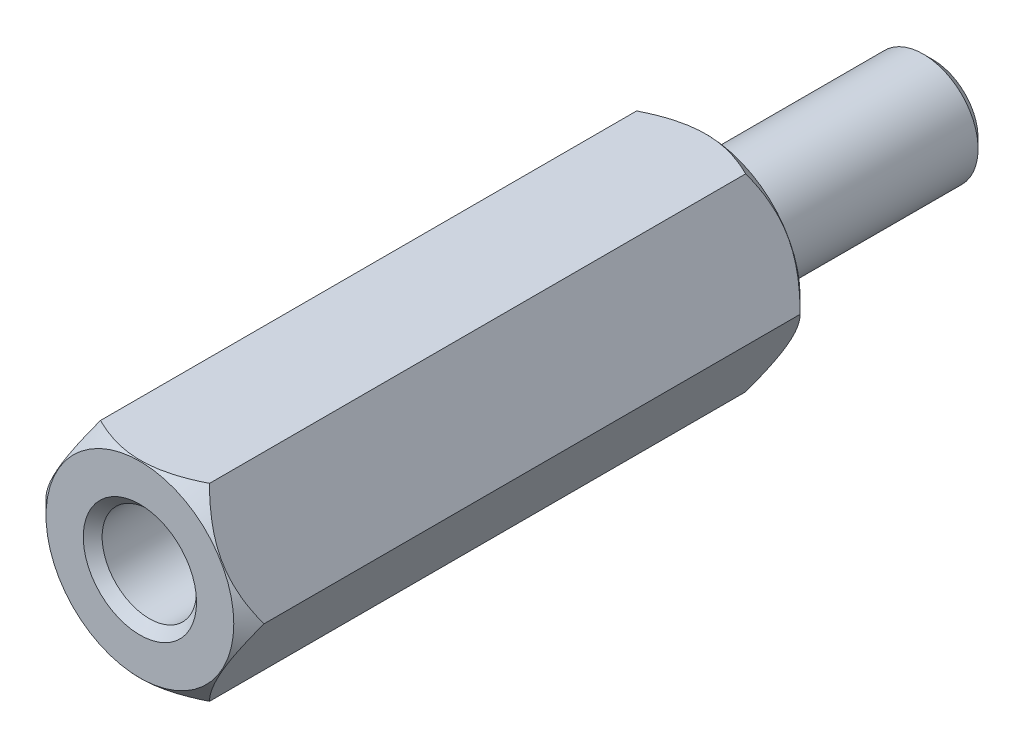
ISO-10303-21;
HEADER;
FILE_DESCRIPTION(('STEP AP214'),'2;1');
FILE_NAME('part.step','',(''),(''),'','','');
FILE_SCHEMA(('AUTOMOTIVE_DESIGN { 1 0 10303 214 1 1 1 1 }'));
ENDSEC;
DATA;
#1=APPLICATION_CONTEXT('core data for automotive mechanical design processes');
#2=APPLICATION_PROTOCOL_DEFINITION('international standard','automotive_design',2000,#1);
#3=PRODUCT_CONTEXT('',#1,'mechanical');
#4=PRODUCT('Part','Part','',(#3));
#5=PRODUCT_RELATED_PRODUCT_CATEGORY('part','',(#4));
#6=PRODUCT_DEFINITION_FORMATION('','',#4);
#7=PRODUCT_DEFINITION_CONTEXT('part definition',#1,'design');
#8=PRODUCT_DEFINITION('design','',#6,#7);
#9=PRODUCT_DEFINITION_SHAPE('','',#8);
#10=(LENGTH_UNIT() NAMED_UNIT(*) SI_UNIT(.MILLI.,.METRE.));
#11=(NAMED_UNIT(*) PLANE_ANGLE_UNIT() SI_UNIT($,.RADIAN.));
#12=(NAMED_UNIT(*) SI_UNIT($,.STERADIAN.) SOLID_ANGLE_UNIT());
#13=UNCERTAINTY_MEASURE_WITH_UNIT(LENGTH_MEASURE(1.E-05),#10,'distance_accuracy_value','');
#14=(GEOMETRIC_REPRESENTATION_CONTEXT(3) GLOBAL_UNCERTAINTY_ASSIGNED_CONTEXT((#13)) GLOBAL_UNIT_ASSIGNED_CONTEXT((#10,
#11,#12)) REPRESENTATION_CONTEXT('',''));
#15=CARTESIAN_POINT('',(0.,0.,0.));
#16=DIRECTION('',(0.,0.,1.));
#17=DIRECTION('',(1.,0.,0.));
#18=AXIS2_PLACEMENT_3D('',#15,#16,#17);
#19=CARTESIAN_POINT('',(0.,0.,7.5));
#20=DIRECTION('',(0.,0.,1.));
#21=DIRECTION('',(1.,0.,0.));
#22=AXIS2_PLACEMENT_3D('',#19,#20,#21);
#23=CYLINDRICAL_SURFACE('',#22,1.25);
#24=CARTESIAN_POINT('',(0.,0.,7.25));
#25=DIRECTION('',(0.,0.,1.));
#26=DIRECTION('',(1.,0.,0.));
#27=AXIS2_PLACEMENT_3D('',#24,#25,#26);
#28=CIRCLE('',#27,1.25);
#29=CARTESIAN_POINT('',(1.25,0.,7.25));
#30=VERTEX_POINT('',#29);
#31=EDGE_CURVE('E26',#30,#30,#28,.T.);
#32=ORIENTED_EDGE('',*,*,#31,.T.);
#33=EDGE_LOOP('',(#32));
#34=FACE_BOUND('',#33,.T.);
#35=CARTESIAN_POINT('',(0.,0.,-5.5));
#36=DIRECTION('',(0.,0.,-1.));
#37=DIRECTION('',(-1.,0.,0.));
#38=AXIS2_PLACEMENT_3D('',#35,#36,#37);
#39=CIRCLE('',#38,1.25);
#40=CARTESIAN_POINT('',(-1.25,0.,-5.5));
#41=VERTEX_POINT('',#40);
#42=EDGE_CURVE('E90',#41,#41,#39,.F.);
#43=ORIENTED_EDGE('',*,*,#42,.F.);
#44=EDGE_LOOP('',(#43));
#45=FACE_BOUND('',#44,.T.);
#46=ADVANCED_FACE('F17',(#34,#45),#23,.F.);
#47=CARTESIAN_POINT('',(1.44337567297409,-2.5,7.5));
#48=DIRECTION('',(-0.866025403784442,0.5,0.));
#49=DIRECTION('',(-0.5,-0.866025403784442,0.));
#50=AXIS2_PLACEMENT_3D('',#47,#48,#49);
#51=PLANE('',#50);
#52=CARTESIAN_POINT('',(1.44326020292026,-2.5002,7.09988452301824));
#53=CARTESIAN_POINT('',(1.49287669073472,-2.41426172221223,7.14945929464527));
#54=CARTESIAN_POINT('',(1.54332283764113,-2.32688643272424,7.19612251863748));
#55=CARTESIAN_POINT('',(1.64618811625262,-2.14871854383441,7.28156185996168));
#56=CARTESIAN_POINT('',(1.69861703122362,-2.05790899931892,7.32029043759398));
#57=CARTESIAN_POINT('',(1.80433744175989,-1.87479587687307,7.38663329610224));
#58=CARTESIAN_POINT('',(1.85760201171319,-1.78253893547066,7.41441433146912));
#59=CARTESIAN_POINT('',(1.96530378549012,-1.59599399122371,7.45721682408932));
#60=CARTESIAN_POINT('',(2.01973769896308,-1.50171168743371,7.47227023332866));
#61=CARTESIAN_POINT('',(2.11355131286834,-1.33922174170815,7.48585227779051));
#62=CARTESIAN_POINT('',(2.15280980880344,-1.27122403211985,7.48786290075918));
#63=CARTESIAN_POINT('',(2.23126263056552,-1.13533975883078,7.48447588281249));
#64=CARTESIAN_POINT('',(2.2704569290736,-1.06745324244776,7.47907564470016));
#65=CARTESIAN_POINT('',(2.34847544336507,-0.932321211763895,7.46117421159751));
#66=CARTESIAN_POINT('',(2.38729919566126,-0.865076500246443,7.44866507295349));
#67=CARTESIAN_POINT('',(2.46427534467606,-0.731749899181799,7.41723249804427));
#68=CARTESIAN_POINT('',(2.50242779262543,-0.665667920900333,7.39830955350317));
#69=CARTESIAN_POINT('',(2.60015256308362,-0.496403653308724,7.34213263859175));
#70=CARTESIAN_POINT('',(2.6591189485299,-0.394270877777111,7.3006441684038));
#71=CARTESIAN_POINT('',(2.74582384890659,-0.244093585059505,7.23060595327689));
#72=CARTESIAN_POINT('',(2.77439698586414,-0.194603460117405,7.20599774788391));
#73=CARTESIAN_POINT('',(2.83101398781795,-0.0965399361611646,7.15453811328475));
#74=CARTESIAN_POINT('',(2.85905816495514,-0.0479659965030795,7.12768806122064));
#75=CARTESIAN_POINT('',(2.88686681600197,0.000199999999999736,7.09988452301824));
#76=B_SPLINE_CURVE_WITH_KNOTS('',3,(#52,#53,#54,#55,#56,#57,#58,#59,#60,#61,#62,#63,#64,#65,#66,
#67,#68,#69,#70,#71,#72,#73,#74,#75),.UNSPECIFIED.,.F.,.F.,(4,2,2,2,2,2,2,2,2,2,2,4),(0.,
0.333012085133919,0.667964518301393,0.997597032043296,1.32639954393844,1.56169424147168,
1.79707142102082,2.0327121352217,2.26833478775649,2.64260240809531,2.82922877818861,
3.01574133749022),.UNSPECIFIED.);
#77=CARTESIAN_POINT('',(1.4433756729741,-2.5,7.1));
#78=VERTEX_POINT('',#77);
#79=CARTESIAN_POINT('',(2.88675134594813,0.,7.1));
#80=VERTEX_POINT('',#79);
#81=EDGE_CURVE('E70',#78,#80,#76,.T.);
#82=ORIENTED_EDGE('',*,*,#81,.F.);
#83=DIRECTION('',(0.,0.,-1.));
#84=VECTOR('',#83,1.);
#85=CARTESIAN_POINT('',(1.44337567297409,-2.5,7.5));
#86=LINE('',#85,#84);
#87=CARTESIAN_POINT('',(1.44337567297409,-2.5,-7.1));
#88=VERTEX_POINT('',#87);
#89=EDGE_CURVE('E41',#78,#88,#86,.T.);
#90=ORIENTED_EDGE('',*,*,#89,.T.);
#91=CARTESIAN_POINT('',(2.88686681600197,0.0002,-7.09988452301824));
#92=CARTESIAN_POINT('',(2.83725032818752,-0.0857382777877744,-7.14945929464526));
#93=CARTESIAN_POINT('',(2.78680418128111,-0.173113567275765,-7.19612251863748));
#94=CARTESIAN_POINT('',(2.68393890266962,-0.3512814561656,-7.28156185996168));
#95=CARTESIAN_POINT('',(2.63150998769862,-0.442091000681084,-7.32029043759398));
#96=CARTESIAN_POINT('',(2.52578957716236,-0.62520412312693,-7.38663329610224));
#97=CARTESIAN_POINT('',(2.47252500720906,-0.717461064529351,-7.41441433146912));
#98=CARTESIAN_POINT('',(2.36482323343212,-0.904006008776288,-7.45721682408932));
#99=CARTESIAN_POINT('',(2.31038931995914,-0.998288312566276,-7.47227023332865));
#100=CARTESIAN_POINT('',(2.21657570605388,-1.16077825829184,-7.48585227779051));
#101=CARTESIAN_POINT('',(2.17731721011881,-1.22877596788015,-7.48786290075918));
#102=CARTESIAN_POINT('',(2.09886438835673,-1.36466024116922,-7.48447588281249));
#103=CARTESIAN_POINT('',(2.05967008984865,-1.43254675755224,-7.47907564470016));
#104=CARTESIAN_POINT('',(1.98165157555718,-1.5676787882361,-7.46117421159751));
#105=CARTESIAN_POINT('',(1.942827823261,-1.63492349975356,-7.4486650729535));
#106=CARTESIAN_POINT('',(1.86585167424619,-1.7682501008182,-7.41723249804428));
#107=CARTESIAN_POINT('',(1.8276992262968,-1.83433207909966,-7.39830955350318));
#108=CARTESIAN_POINT('',(1.7299744558386,-2.00359634669126,-7.34213263859175));
#109=CARTESIAN_POINT('',(1.67100807039234,-2.10572912222289,-7.3006441684038));
#110=CARTESIAN_POINT('',(1.58430317001566,-2.2559064149405,-7.2306059532769));
#111=CARTESIAN_POINT('',(1.5557300330581,-2.3053965398826,-7.20599774788391));
#112=CARTESIAN_POINT('',(1.49911303110429,-2.40346006383884,-7.15453811328476));
#113=CARTESIAN_POINT('',(1.47106885396709,-2.45203400349692,-7.12768806122064));
#114=CARTESIAN_POINT('',(1.44326020292026,-2.5002,-7.09988452301824));
#115=B_SPLINE_CURVE_WITH_KNOTS('',3,(#91,#92,#93,#94,#95,#96,#97,#98,#99,#100,#101,#102,#103,
#104,#105,#106,#107,#108,#109,#110,#111,#112,#113,#114),.UNSPECIFIED.,.F.,.F.,(4,2,2,2,2,2,2,2,
2,2,2,4),(0.,0.333012085133916,0.667964518301388,0.997597032043286,1.32639954393842,
1.56169424147166,1.7970714210208,2.03271213522168,2.26833478775648,2.6426024080953,
2.82922877818861,3.01574133749022),.UNSPECIFIED.);
#116=CARTESIAN_POINT('',(2.88675134594813,0.,-7.1));
#117=VERTEX_POINT('',#116);
#118=EDGE_CURVE('E89',#117,#88,#115,.T.);
#119=ORIENTED_EDGE('',*,*,#118,.F.);
#120=DIRECTION('',(0.,0.,-1.));
#121=VECTOR('',#120,1.);
#122=CARTESIAN_POINT('',(2.88675134594813,0.,7.5));
#123=LINE('',#122,#121);
#124=EDGE_CURVE('E83',#80,#117,#123,.T.);
#125=ORIENTED_EDGE('',*,*,#124,.F.);
#126=EDGE_LOOP('',(#82,#90,#119,#125));
#127=FACE_BOUND('',#126,.T.);
#128=ADVANCED_FACE('F88',(#127),#51,.F.);
#129=CARTESIAN_POINT('',(2.88675134594813,0.,7.5));
#130=DIRECTION('',(-0.866025403784438,-0.5,0.));
#131=DIRECTION('',(0.5,-0.866025403784438,0.));
#132=AXIS2_PLACEMENT_3D('',#129,#130,#131);
#133=PLANE('',#132);
#134=CARTESIAN_POINT('',(2.88686681600197,-0.0002,7.09988452301824));
#135=CARTESIAN_POINT('',(2.83725032818751,0.0857382777877649,7.14945929464527));
#136=CARTESIAN_POINT('',(2.7868041812811,0.173113567275753,7.19612251863749));
#137=CARTESIAN_POINT('',(2.6839389026696,0.351281456165588,7.2815618599617));
#138=CARTESIAN_POINT('',(2.6315099876986,0.442091000681075,7.320290437594));
#139=CARTESIAN_POINT('',(2.52578957716234,0.625204123126921,7.38663329610226));
#140=CARTESIAN_POINT('',(2.47252500720904,0.717461064529341,7.41441433146914));
#141=CARTESIAN_POINT('',(2.3648232334321,0.904006008776286,7.45721682408934));
#142=CARTESIAN_POINT('',(2.31038931995913,0.998288312566283,7.47227023332866));
#143=CARTESIAN_POINT('',(2.21657570605387,1.16077825829184,7.48585227779052));
#144=CARTESIAN_POINT('',(2.17731721011878,1.22877596788015,7.4878629007592));
#145=CARTESIAN_POINT('',(2.0988643883567,1.36466024116922,7.48447588281251));
#146=CARTESIAN_POINT('',(2.05967008984862,1.43254675755224,7.47907564470018));
#147=CARTESIAN_POINT('',(1.98165157555715,1.5676787882361,7.46117421159753));
#148=CARTESIAN_POINT('',(1.94282782326097,1.63492349975356,7.44866507295352));
#149=CARTESIAN_POINT('',(1.86585167424616,1.7682501008182,7.4172324980443));
#150=CARTESIAN_POINT('',(1.82769922629678,1.83433207909966,7.39830955350319));
#151=CARTESIAN_POINT('',(1.72997445583858,2.00359634669126,7.34213263859176));
#152=CARTESIAN_POINT('',(1.67100807039231,2.10572912222289,7.30064416840382));
#153=CARTESIAN_POINT('',(1.58430317001562,2.25590641494051,7.23060595327691));
#154=CARTESIAN_POINT('',(1.55573003305807,2.30539653988261,7.20599774788393));
#155=CARTESIAN_POINT('',(1.49911303110426,2.40346006383885,7.15453811328477));
#156=CARTESIAN_POINT('',(1.47106885396706,2.45203400349693,7.12768806122065));
#157=CARTESIAN_POINT('',(1.44326020292022,2.5002,7.09988452301824));
#158=B_SPLINE_CURVE_WITH_KNOTS('',3,(#134,#135,#136,#137,#138,#139,#140,#141,#142,#143,#144,
#145,#146,#147,#148,#149,#150,#151,#152,#153,#154,#155,#156,#157),.UNSPECIFIED.,.F.,.F.,(4,2,2,
2,2,2,2,2,2,2,2,4),(0.,0.333012085133923,0.667964518301397,0.997597032043299,1.32639954393844,
1.56169424147168,1.79707142102083,2.0327121352217,2.2683347877565,2.64260240809533,
2.82922877818864,3.01574133749025),.UNSPECIFIED.);
#159=CARTESIAN_POINT('',(1.44337567297406,2.5,7.1));
#160=VERTEX_POINT('',#159);
#161=EDGE_CURVE('E73',#80,#160,#158,.T.);
#162=ORIENTED_EDGE('',*,*,#161,.F.);
#163=ORIENTED_EDGE('',*,*,#124,.T.);
#164=CARTESIAN_POINT('',(1.44326020292022,2.5002,-7.09988452301824));
#165=CARTESIAN_POINT('',(1.49287669073468,2.41426172221224,-7.14945929464527));
#166=CARTESIAN_POINT('',(1.5433228376411,2.32688643272425,-7.19612251863749));
#167=CARTESIAN_POINT('',(1.64618811625259,2.14871854383441,-7.2815618599617));
#168=CARTESIAN_POINT('',(1.69861703122359,2.05790899931893,-7.320290437594));
#169=CARTESIAN_POINT('',(1.80433744175985,1.87479587687308,-7.38663329610226));
#170=CARTESIAN_POINT('',(1.85760201171315,1.78253893547066,-7.41441433146914));
#171=CARTESIAN_POINT('',(1.96530378549009,1.59599399122372,-7.45721682408934));
#172=CARTESIAN_POINT('',(2.01973769896306,1.50171168743372,-7.47227023332866));
#173=CARTESIAN_POINT('',(2.11355131286832,1.33922174170816,-7.48585227779052));
#174=CARTESIAN_POINT('',(2.15280980880341,1.27122403211985,-7.4878629007592));
#175=CARTESIAN_POINT('',(2.23126263056549,1.13533975883079,-7.48447588281251));
#176=CARTESIAN_POINT('',(2.27045692907357,1.06745324244777,-7.47907564470018));
#177=CARTESIAN_POINT('',(2.34847544336504,0.932321211763901,-7.46117421159753));
#178=CARTESIAN_POINT('',(2.38729919566122,0.865076500246447,-7.44866507295352));
#179=CARTESIAN_POINT('',(2.46427534467603,0.731749899181808,-7.41723249804429));
#180=CARTESIAN_POINT('',(2.50242779262541,0.66566792090035,-7.39830955350319));
#181=CARTESIAN_POINT('',(2.60015256308361,0.496403653308741,-7.34213263859176));
#182=CARTESIAN_POINT('',(2.65911894852988,0.394270877777113,-7.30064416840382));
#183=CARTESIAN_POINT('',(2.74582384890657,0.244093585059495,-7.23060595327691));
#184=CARTESIAN_POINT('',(2.77439698586412,0.194603460117394,-7.20599774788393));
#185=CARTESIAN_POINT('',(2.83101398781794,0.096539936161155,-7.15453811328477));
#186=CARTESIAN_POINT('',(2.85905816495513,0.0479659965030728,-7.12768806122065));
#187=CARTESIAN_POINT('',(2.88686681600197,-0.000200000000000316,-7.09988452301824));
#188=B_SPLINE_CURVE_WITH_KNOTS('',3,(#164,#165,#166,#167,#168,#169,#170,#171,#172,#173,#174,
#175,#176,#177,#178,#179,#180,#181,#182,#183,#184,#185,#186,#187),.UNSPECIFIED.,.F.,.F.,(4,2,2,
2,2,2,2,2,2,2,2,4),(0.,0.333012085133922,0.667964518301395,0.997597032043296,1.32639954393844,
1.56169424147168,1.79707142102082,2.0327121352217,2.2683347877565,2.64260240809533,
2.82922877818864,3.01574133749025),.UNSPECIFIED.);
#189=CARTESIAN_POINT('',(1.44337567297406,2.5,-7.1));
#190=VERTEX_POINT('',#189);
#191=EDGE_CURVE('E215',#190,#117,#188,.T.);
#192=ORIENTED_EDGE('',*,*,#191,.F.);
#193=DIRECTION('',(0.,0.,-1.));
#194=VECTOR('',#193,1.);
#195=CARTESIAN_POINT('',(1.44337567297406,2.5,7.5));
#196=LINE('',#195,#194);
#197=EDGE_CURVE('E85',#160,#190,#196,.T.);
#198=ORIENTED_EDGE('',*,*,#197,.F.);
#199=EDGE_LOOP('',(#162,#163,#192,#198));
#200=FACE_BOUND('',#199,.T.);
#201=ADVANCED_FACE('F81',(#200),#133,.F.);
#202=CARTESIAN_POINT('',(1.44337567297406,2.5,7.5));
#203=DIRECTION('',(0.,-1.,0.));
#204=DIRECTION('',(1.,0.,0.));
#205=AXIS2_PLACEMENT_3D('',#202,#203,#204);
#206=PLANE('',#205);
#207=CARTESIAN_POINT('',(4.35790807222665,2.5,4.96267304580409));
#208=CARTESIAN_POINT('',(4.22900505074815,2.50000000000001,5.07444020651168));
#209=CARTESIAN_POINT('',(4.09952897907173,2.50000000000001,5.18556009439583));
#210=CARTESIAN_POINT('',(3.83898638028681,2.50000000000001,5.40604374915114));
#211=CARTESIAN_POINT('',(3.70791912620545,2.50000000000001,5.51540665588043));
#212=CARTESIAN_POINT('',(3.44083760855067,2.50000000000001,5.7342940749196));
#213=CARTESIAN_POINT('',(3.30477887797079,2.50000000000001,5.84376454299069));
#214=CARTESIAN_POINT('',(3.03009587684347,2.5,6.05938263287972));
#215=CARTESIAN_POINT('',(2.89147225782007,2.5,6.1655310805966));
#216=CARTESIAN_POINT('',(2.61062429451692,2.5,6.37338578520497));
#217=CARTESIAN_POINT('',(2.46839537969833,2.5,6.47508590704005));
#218=CARTESIAN_POINT('',(2.17925486790779,2.5,6.67194970638111));
#219=CARTESIAN_POINT('',(2.03233957265132,2.5,6.76710802470617));
#220=CARTESIAN_POINT('',(1.73361597358268,2.5,6.94680833734888));
#221=CARTESIAN_POINT('',(1.58185407011246,2.5,7.0314264527755));
#222=CARTESIAN_POINT('',(1.27084130527911,2.5,7.18552599595446));
#223=CARTESIAN_POINT('',(1.11160488303032,2.5,7.25503525688872));
#224=CARTESIAN_POINT('',(0.864657376231807,2.5,7.34259642513528));
#225=CARTESIAN_POINT('',(0.779993026222523,2.5,7.36920046305057));
#226=CARTESIAN_POINT('',(0.608668935092176,2.5,7.41504582346073));
#227=CARTESIAN_POINT('',(0.522009514777896,2.5,7.43428832104285));
#228=CARTESIAN_POINT('',(0.34773955693234,2.5,7.4641318069513));
#229=CARTESIAN_POINT('',(0.260138222188826,2.49999999999999,7.47478552783329));
#230=CARTESIAN_POINT('',(0.0842961272603183,2.5,7.48686770307153));
#231=CARTESIAN_POINT('',(-0.0039445643884417,2.5,7.48829713200226));
#232=CARTESIAN_POINT('',(-0.180192018780209,2.5,7.48181608276146));
#233=CARTESIAN_POINT('',(-0.268198313940583,2.5,7.47389317264444));
#234=CARTESIAN_POINT('',(-0.442968473014174,2.49999999999999,7.44928693602144));
#235=CARTESIAN_POINT('',(-0.529732088460505,2.49999999999999,7.43260188201526));
#236=CARTESIAN_POINT('',(-0.702003641636136,2.49999999999999,7.39141807606219));
#237=CARTESIAN_POINT('',(-0.787498274243353,2.49999999999999,7.36686463906262));
#238=CARTESIAN_POINT('',(-0.956318998116781,2.49999999999999,7.31127227919823));
#239=CARTESIAN_POINT('',(-1.03964506444263,2.5,7.28023328178095));
#240=CARTESIAN_POINT('',(-1.22260914379836,2.5,7.20532752613879));
#241=CARTESIAN_POINT('',(-1.32170415747565,2.49999999999999,7.16014559308748));
#242=CARTESIAN_POINT('',(-1.5169438537106,2.49999999999999,7.06375515379207));
#243=CARTESIAN_POINT('',(-1.61308679170486,2.49999999999999,7.01254316726495));
#244=CARTESIAN_POINT('',(-1.8029661421963,2.49999999999999,6.90543166741101));
#245=CARTESIAN_POINT('',(-1.89669715950608,2.49999999999999,6.84952266760245));
#246=CARTESIAN_POINT('',(-2.0819280024094,2.49999999999999,6.73418674307866));
#247=CARTESIAN_POINT('',(-2.17342826625814,2.49999999999999,6.67476051735268));
#248=CARTESIAN_POINT('',(-2.35505847652761,2.49999999999999,6.55284030367593));
#249=CARTESIAN_POINT('',(-2.44517856997303,2.49999999999999,6.49033170499246));
#250=CARTESIAN_POINT('',(-2.62385919422448,2.49999999999999,6.36311875000848));
#251=CARTESIAN_POINT('',(-2.71241960671454,2.49999999999998,6.29841422820776));
#252=CARTESIAN_POINT('',(-2.97593968609534,2.49999999999999,6.10184992046112));
#253=CARTESIAN_POINT('',(-3.14895696314841,2.5,5.9673892948415));
#254=CARTESIAN_POINT('',(-3.49727644035016,2.5,5.68911816701069));
#255=CARTESIAN_POINT('',(-3.67244750970819,2.49999999999999,5.54514512901894));
#256=CARTESIAN_POINT('',(-3.9321211000153,2.49999999999998,5.32741624538674));
#257=CARTESIAN_POINT('',(-4.01770626505476,2.49999999999998,5.25494531232854));
#258=CARTESIAN_POINT('',(-4.18824952148341,2.49999999999998,5.10930608888149));
#259=CARTESIAN_POINT('',(-4.2732077442148,2.49999999999999,5.03613795236393));
#260=CARTESIAN_POINT('',(-4.35790807222667,2.5,4.96267304580409));
#261=B_SPLINE_CURVE_WITH_KNOTS('',3,(#207,#208,#209,#210,#211,#212,#213,#214,#215,#216,#217,
#218,#219,#220,#221,#222,#223,#224,#225,#226,#227,#228,#229,#230,#231,#232,#233,#234,#235,#236,
#237,#238,#239,#240,#241,#242,#243,#244,#245,#246,#247,#248,#249,#250,#251,#252,#253,#254,#255,
#256,#257,#258,#259,#260),.UNSPECIFIED.,.F.,.F.,(4,2,2,2,2,2,2,2,2,2,2,2,2,2,2,2,2,2,2,2,2,2,2,
2,2,2,4),(0.,0.511842212813336,1.02392780167291,1.54778169920521,2.07150430797679,
2.59592780979257,3.12077593308527,3.6415817306556,4.16141982425733,4.42739176689035,
4.69332123596952,4.95760526901695,5.22186137919605,5.4864691576042,5.75112912434679,
6.01766988465733,6.28421370906123,6.61066447125655,6.93730457870705,7.26462103112129,
7.59187265192316,7.92086150920112,8.24987521669915,8.90710736338423,9.58728616124552,
9.92372274140157,10.2600867154781),.UNSPECIFIED.);
#262=CARTESIAN_POINT('',(-1.44337567297408,2.5,7.1));
#263=VERTEX_POINT('',#262);
#264=EDGE_CURVE('E86',#160,#263,#261,.T.);
#265=ORIENTED_EDGE('',*,*,#264,.F.);
#266=ORIENTED_EDGE('',*,*,#197,.T.);
#267=CARTESIAN_POINT('',(-4.35790807222667,2.5,-4.96267304580409));
#268=CARTESIAN_POINT('',(-4.22900505074817,2.49999999999999,-5.07444020651168));
#269=CARTESIAN_POINT('',(-4.09952897907174,2.49999999999998,-5.18556009439584));
#270=CARTESIAN_POINT('',(-3.83898638028682,2.49999999999998,-5.40604374915114));
#271=CARTESIAN_POINT('',(-3.70791912620547,2.49999999999998,-5.51540665588043));
#272=CARTESIAN_POINT('',(-3.44083760855069,2.49999999999998,-5.7342940749196));
#273=CARTESIAN_POINT('',(-3.30477887797081,2.49999999999998,-5.84376454299069));
#274=CARTESIAN_POINT('',(-3.03009587684349,2.49999999999999,-6.05938263287972));
#275=CARTESIAN_POINT('',(-2.89147225782008,2.5,-6.1655310805966));
#276=CARTESIAN_POINT('',(-2.61062429451694,2.5,-6.37338578520497));
#277=CARTESIAN_POINT('',(-2.46839537969835,2.49999999999999,-6.47508590704005));
#278=CARTESIAN_POINT('',(-2.17925486790781,2.49999999999998,-6.67194970638112));
#279=CARTESIAN_POINT('',(-2.03233957265133,2.49999999999999,-6.76710802470617));
#280=CARTESIAN_POINT('',(-1.7336159735827,2.49999999999999,-6.94680833734888));
#281=CARTESIAN_POINT('',(-1.58185407011248,2.49999999999999,-7.0314264527755));
#282=CARTESIAN_POINT('',(-1.27084130527913,2.49999999999999,-7.18552599595446));
#283=CARTESIAN_POINT('',(-1.11160488303034,2.5,-7.25503525688872));
#284=CARTESIAN_POINT('',(-0.864657376231824,2.5,-7.34259642513528));
#285=CARTESIAN_POINT('',(-0.779993026222541,2.49999999999999,-7.36920046305057));
#286=CARTESIAN_POINT('',(-0.608668935092194,2.49999999999999,-7.41504582346073));
#287=CARTESIAN_POINT('',(-0.522009514777913,2.49999999999999,-7.43428832104285));
#288=CARTESIAN_POINT('',(-0.347739556932357,2.49999999999999,-7.4641318069513));
#289=CARTESIAN_POINT('',(-0.260138222188843,2.49999999999999,-7.47478552783329));
#290=CARTESIAN_POINT('',(-0.0842961272603345,2.5,-7.48686770307153));
#291=CARTESIAN_POINT('',(0.00394456438842556,2.5,-7.48829713200226));
#292=CARTESIAN_POINT('',(0.180192018780194,2.5,-7.48181608276146));
#293=CARTESIAN_POINT('',(0.268198313940567,2.5,-7.47389317264444));
#294=CARTESIAN_POINT('',(0.442968473014159,2.5,-7.44928693602144));
#295=CARTESIAN_POINT('',(0.52973208846049,2.5,-7.43260188201526));
#296=CARTESIAN_POINT('',(0.702003641636121,2.5,-7.39141807606219));
#297=CARTESIAN_POINT('',(0.787498274243338,2.5,-7.36686463906262));
#298=CARTESIAN_POINT('',(0.956318998116767,2.5,-7.31127227919823));
#299=CARTESIAN_POINT('',(1.03964506444261,2.5,-7.28023328178095));
#300=CARTESIAN_POINT('',(1.22260914379835,2.5,-7.20532752613879));
#301=CARTESIAN_POINT('',(1.32170415747563,2.5,-7.16014559308748));
#302=CARTESIAN_POINT('',(1.51694385371059,2.5,-7.06375515379207));
#303=CARTESIAN_POINT('',(1.61308679170485,2.5,-7.01254316726495));
#304=CARTESIAN_POINT('',(1.80296614219629,2.5,-6.90543166741101));
#305=CARTESIAN_POINT('',(1.89669715950607,2.5,-6.84952266760245));
#306=CARTESIAN_POINT('',(2.08192800240939,2.5,-6.73418674307866));
#307=CARTESIAN_POINT('',(2.17342826625813,2.5,-6.67476051735268));
#308=CARTESIAN_POINT('',(2.3550584765276,2.5,-6.55284030367593));
#309=CARTESIAN_POINT('',(2.44517856997302,2.5,-6.49033170499245));
#310=CARTESIAN_POINT('',(2.62385919422447,2.5,-6.36311875000847));
#311=CARTESIAN_POINT('',(2.71241960671453,2.50000000000001,-6.29841422820775));
#312=CARTESIAN_POINT('',(2.97593968609533,2.5,-6.10184992046111));
#313=CARTESIAN_POINT('',(3.1489569631484,2.5,-5.96738929484149));
#314=CARTESIAN_POINT('',(3.49727644035014,2.5,-5.68911816701068));
#315=CARTESIAN_POINT('',(3.67244750970818,2.50000000000001,-5.54514512901893));
#316=CARTESIAN_POINT('',(3.93212110001529,2.50000000000001,-5.32741624538673));
#317=CARTESIAN_POINT('',(4.01770626505474,2.50000000000001,-5.25494531232854));
#318=CARTESIAN_POINT('',(4.18824952148339,2.50000000000001,-5.10930608888148));
#319=CARTESIAN_POINT('',(4.27320774421478,2.50000000000001,-5.03613795236393));
#320=CARTESIAN_POINT('',(4.35790807222665,2.5,-4.96267304580409));
#321=B_SPLINE_CURVE_WITH_KNOTS('',3,(#267,#268,#269,#270,#271,#272,#273,#274,#275,#276,#277,
#278,#279,#280,#281,#282,#283,#284,#285,#286,#287,#288,#289,#290,#291,#292,#293,#294,#295,#296,
#297,#298,#299,#300,#301,#302,#303,#304,#305,#306,#307,#308,#309,#310,#311,#312,#313,#314,#315,
#316,#317,#318,#319,#320),.UNSPECIFIED.,.F.,.F.,(4,2,2,2,2,2,2,2,2,2,2,2,2,2,2,2,2,2,2,2,2,2,2,
2,2,2,4),(0.,0.511842212813335,1.02392780167291,1.54778169920521,2.0715043079768,
2.59592780979257,3.12077593308527,3.6415817306556,4.16141982425733,4.42739176689035,
4.69332123596952,4.95760526901695,5.22186137919604,5.4864691576042,5.75112912434679,
6.01766988465733,6.28421370906123,6.61066447125655,6.93730457870706,7.26462103112129,
7.59187265192317,7.92086150920113,8.24987521669916,8.90710736338423,9.58728616124552,
9.92372274140157,10.2600867154781),.UNSPECIFIED.);
#322=CARTESIAN_POINT('',(-1.44337567297408,2.5,-7.1));
#323=VERTEX_POINT('',#322);
#324=EDGE_CURVE('E222',#323,#190,#321,.T.);
#325=ORIENTED_EDGE('',*,*,#324,.F.);
#326=DIRECTION('',(0.,0.,-1.));
#327=VECTOR('',#326,1.);
#328=CARTESIAN_POINT('',(-1.44337567297408,2.5,7.5));
#329=LINE('',#328,#327);
#330=EDGE_CURVE('E95',#263,#323,#329,.T.);
#331=ORIENTED_EDGE('',*,*,#330,.F.);
#332=EDGE_LOOP('',(#265,#266,#325,#331));
#333=FACE_BOUND('',#332,.T.);
#334=ADVANCED_FACE('F209',(#333),#206,.F.);
#335=CARTESIAN_POINT('',(-1.44337567297408,2.5,7.5));
#336=DIRECTION('',(0.866025403784442,-0.5,0.));
#337=DIRECTION('',(0.5,0.866025403784442,0.));
#338=AXIS2_PLACEMENT_3D('',#335,#336,#337);
#339=PLANE('',#338);
#340=CARTESIAN_POINT('',(-1.44326020292024,2.5002,7.09988452301824));
#341=CARTESIAN_POINT('',(-1.4928766907347,2.41426172221223,7.14945929464527));
#342=CARTESIAN_POINT('',(-1.54332283764111,2.32688643272424,7.19612251863749));
#343=CARTESIAN_POINT('',(-1.6461881162526,2.14871854383441,7.2815618599617));
#344=CARTESIAN_POINT('',(-1.69861703122361,2.05790899931892,7.320290437594));
#345=CARTESIAN_POINT('',(-1.80433744175987,1.87479587687307,7.38663329610226));
#346=CARTESIAN_POINT('',(-1.85760201171317,1.78253893547065,7.41441433146914));
#347=CARTESIAN_POINT('',(-1.9653037854901,1.59599399122371,7.45721682408933));
#348=CARTESIAN_POINT('',(-2.01973769896307,1.50171168743371,7.47227023332866));
#349=CARTESIAN_POINT('',(-2.11355131286833,1.33922174170815,7.48585227779052));
#350=CARTESIAN_POINT('',(-2.15280980880342,1.27122403211984,7.4878629007592));
#351=CARTESIAN_POINT('',(-2.23126263056551,1.13533975883078,7.4844758828125));
#352=CARTESIAN_POINT('',(-2.27045692907358,1.06745324244776,7.47907564470017));
#353=CARTESIAN_POINT('',(-2.34847544336506,0.932321211763891,7.46117421159752));
#354=CARTESIAN_POINT('',(-2.38729919566124,0.865076500246438,7.44866507295351));
#355=CARTESIAN_POINT('',(-2.46427534467604,0.731749899181797,7.41723249804429));
#356=CARTESIAN_POINT('',(-2.50242779262542,0.665667920900335,7.39830955350319));
#357=CARTESIAN_POINT('',(-2.60015256308362,0.496403653308723,7.34213263859176));
#358=CARTESIAN_POINT('',(-2.65911894852989,0.394270877777101,7.30064416840381));
#359=CARTESIAN_POINT('',(-2.74582384890658,0.244093585059488,7.2306059532769));
#360=CARTESIAN_POINT('',(-2.77439698586413,0.194603460117387,7.20599774788392));
#361=CARTESIAN_POINT('',(-2.83101398781795,0.0965399361611446,7.15453811328476));
#362=CARTESIAN_POINT('',(-2.85905816495514,0.0479659965030592,7.12768806122064));
#363=CARTESIAN_POINT('',(-2.88686681600197,-0.000200000000019851,7.09988452301824));
#364=B_SPLINE_CURVE_WITH_KNOTS('',3,(#340,#341,#342,#343,#344,#345,#346,#347,#348,#349,#350,
#351,#352,#353,#354,#355,#356,#357,#358,#359,#360,#361,#362,#363),.UNSPECIFIED.,.F.,.F.,(4,2,2,
2,2,2,2,2,2,2,2,4),(0.,0.333012085133923,0.667964518301399,0.997597032043302,1.32639954393844,
1.56169424147169,1.79707142102083,2.03271213522171,2.2683347877565,2.64260240809533,
2.82922877818864,3.01574133749025),.UNSPECIFIED.);
#365=CARTESIAN_POINT('',(-2.88675134594813,0.,7.1));
#366=VERTEX_POINT('',#365);
#367=EDGE_CURVE('E187',#263,#366,#364,.T.);
#368=ORIENTED_EDGE('',*,*,#367,.F.);
#369=ORIENTED_EDGE('',*,*,#330,.T.);
#370=CARTESIAN_POINT('',(-2.88686681600197,-0.000200000000020158,-7.09988452301824));
#371=CARTESIAN_POINT('',(-2.83725032818752,0.0857382777877513,-7.14945929464527));
#372=CARTESIAN_POINT('',(-2.78680418128111,0.173113567275742,-7.19612251863749));
#373=CARTESIAN_POINT('',(-2.68393890266962,0.351281456165579,-7.28156185996169));
#374=CARTESIAN_POINT('',(-2.63150998769861,0.442091000681065,-7.32029043759399));
#375=CARTESIAN_POINT('',(-2.52578957716235,0.625204123126911,-7.38663329610225));
#376=CARTESIAN_POINT('',(-2.47252500720905,0.717461064529332,-7.41441433146913));
#377=CARTESIAN_POINT('',(-2.36482323343211,0.904006008776274,-7.45721682408933));
#378=CARTESIAN_POINT('',(-2.31038931995914,0.998288312566267,-7.47227023332866));
#379=CARTESIAN_POINT('',(-2.21657570605388,1.16077825829183,-7.48585227779052));
#380=CARTESIAN_POINT('',(-2.1773172101188,1.22877596788014,-7.48786290075919));
#381=CARTESIAN_POINT('',(-2.09886438835672,1.36466024116921,-7.4844758828125));
#382=CARTESIAN_POINT('',(-2.05967008984864,1.43254675755222,-7.47907564470017));
#383=CARTESIAN_POINT('',(-1.98165157555717,1.56767878823609,-7.46117421159752));
#384=CARTESIAN_POINT('',(-1.94282782326099,1.63492349975354,-7.44866507295352));
#385=CARTESIAN_POINT('',(-1.86585167424618,1.76825010081818,-7.41723249804429));
#386=CARTESIAN_POINT('',(-1.82769922629679,1.83433207909964,-7.39830955350319));
#387=CARTESIAN_POINT('',(-1.72997445583859,2.00359634669125,-7.34213263859176));
#388=CARTESIAN_POINT('',(-1.67100807039232,2.10572912222288,-7.30064416840381));
#389=CARTESIAN_POINT('',(-1.58430317001564,2.2559064149405,-7.23060595327691));
#390=CARTESIAN_POINT('',(-1.55573003305809,2.3053965398826,-7.20599774788392));
#391=CARTESIAN_POINT('',(-1.49911303110427,2.40346006383884,-7.15453811328476));
#392=CARTESIAN_POINT('',(-1.47106885396708,2.45203400349692,-7.12768806122065));
#393=CARTESIAN_POINT('',(-1.44326020292024,2.5002,-7.09988452301824));
#394=B_SPLINE_CURVE_WITH_KNOTS('',3,(#370,#371,#372,#373,#374,#375,#376,#377,#378,#379,#380,
#381,#382,#383,#384,#385,#386,#387,#388,#389,#390,#391,#392,#393),.UNSPECIFIED.,.F.,.F.,(4,2,2,
2,2,2,2,2,2,2,2,4),(0.,0.333012085133921,0.667964518301395,0.997597032043297,1.32639954393844,
1.56169424147168,1.79707142102082,2.0327121352217,2.2683347877565,2.64260240809533,
2.82922877818864,3.01574133749025),.UNSPECIFIED.);
#395=CARTESIAN_POINT('',(-2.88675134594813,0.,-7.1));
#396=VERTEX_POINT('',#395);
#397=EDGE_CURVE('E244',#396,#323,#394,.T.);
#398=ORIENTED_EDGE('',*,*,#397,.F.);
#399=DIRECTION('',(0.,0.,-1.));
#400=VECTOR('',#399,1.);
#401=CARTESIAN_POINT('',(-2.88675134594813,0.,7.5));
#402=LINE('',#401,#400);
#403=EDGE_CURVE('E236',#366,#396,#402,.T.);
#404=ORIENTED_EDGE('',*,*,#403,.F.);
#405=EDGE_LOOP('',(#368,#369,#398,#404));
#406=FACE_BOUND('',#405,.T.);
#407=ADVANCED_FACE('F242',(#406),#339,.F.);
#408=CARTESIAN_POINT('',(-2.88675134594813,0.,7.5));
#409=DIRECTION('',(0.866025403784435,0.500000000000007,0.));
#410=DIRECTION('',(-0.500000000000007,0.866025403784435,0.));
#411=AXIS2_PLACEMENT_3D('',#408,#409,#410);
#412=PLANE('',#411);
#413=CARTESIAN_POINT('',(-2.88686681600197,0.000199999999979842,7.09988452301824));
#414=CARTESIAN_POINT('',(-2.83725032818751,-0.0857382777877847,7.14945929464527));
#415=CARTESIAN_POINT('',(-2.7868041812811,-0.173113567275773,7.19612251863749));
#416=CARTESIAN_POINT('',(-2.6839389026696,-0.351281456165607,7.2815618599617));
#417=CARTESIAN_POINT('',(-2.6315099876986,-0.442091000681092,7.320290437594));
#418=CARTESIAN_POINT('',(-2.52578957716233,-0.625204123126937,7.38663329610226));
#419=CARTESIAN_POINT('',(-2.47252500720903,-0.717461064529357,7.41441433146914));
#420=CARTESIAN_POINT('',(-2.3648232334321,-0.904006008776302,7.45721682408934));
#421=CARTESIAN_POINT('',(-2.31038931995912,-0.998288312566299,7.47227023332866));
#422=CARTESIAN_POINT('',(-2.21657570605386,-1.16077825829186,7.48585227779052));
#423=CARTESIAN_POINT('',(-2.17731721011877,-1.22877596788016,7.4878629007592));
#424=CARTESIAN_POINT('',(-2.09886438835669,-1.36466024116923,7.48447588281251));
#425=CARTESIAN_POINT('',(-2.05967008984861,-1.43254675755225,7.47907564470018));
#426=CARTESIAN_POINT('',(-1.98165157555714,-1.56767878823612,7.46117421159753));
#427=CARTESIAN_POINT('',(-1.94282782326096,-1.63492349975357,7.44866507295352));
#428=CARTESIAN_POINT('',(-1.86585167424615,-1.76825010081821,7.4172324980443));
#429=CARTESIAN_POINT('',(-1.82769922629676,-1.83433207909967,7.39830955350319));
#430=CARTESIAN_POINT('',(-1.72997445583856,-2.00359634669127,7.34213263859176));
#431=CARTESIAN_POINT('',(-1.67100807039229,-2.1057291222229,7.30064416840382));
#432=CARTESIAN_POINT('',(-1.58430317001561,-2.25590641494051,7.23060595327692));
#433=CARTESIAN_POINT('',(-1.55573003305806,-2.30539653988262,7.20599774788393));
#434=CARTESIAN_POINT('',(-1.49911303110424,-2.40346006383885,7.15453811328477));
#435=CARTESIAN_POINT('',(-1.47106885396704,-2.45203400349693,7.12768806122065));
#436=CARTESIAN_POINT('',(-1.4432602029202,-2.5002,7.09988452301824));
#437=B_SPLINE_CURVE_WITH_KNOTS('',3,(#413,#414,#415,#416,#417,#418,#419,#420,#421,#422,#423,
#424,#425,#426,#427,#428,#429,#430,#431,#432,#433,#434,#435,#436),.UNSPECIFIED.,.F.,.F.,(4,2,2,
2,2,2,2,2,2,2,2,4),(0.,0.333012085133923,0.667964518301396,0.997597032043299,1.32639954393844,
1.56169424147168,1.79707142102083,2.0327121352217,2.2683347877565,2.64260240809533,
2.82922877818863,3.01574133749024),.UNSPECIFIED.);
#438=CARTESIAN_POINT('',(-1.44337567297404,-2.5,7.1));
#439=VERTEX_POINT('',#438);
#440=EDGE_CURVE('E33',#366,#439,#437,.T.);
#441=ORIENTED_EDGE('',*,*,#440,.F.);
#442=ORIENTED_EDGE('',*,*,#403,.T.);
#443=CARTESIAN_POINT('',(-1.4432602029202,-2.5002,-7.09988452301824));
#444=CARTESIAN_POINT('',(-1.49287669073467,-2.41426172221224,-7.14945929464528));
#445=CARTESIAN_POINT('',(-1.54332283764108,-2.32688643272425,-7.1961225186375));
#446=CARTESIAN_POINT('',(-1.64618811625258,-2.14871854383442,-7.2815618599617));
#447=CARTESIAN_POINT('',(-1.69861703122358,-2.05790899931894,-7.320290437594));
#448=CARTESIAN_POINT('',(-1.80433744175984,-1.87479587687309,-7.38663329610226));
#449=CARTESIAN_POINT('',(-1.85760201171314,-1.78253893547067,-7.41441433146915));
#450=CARTESIAN_POINT('',(-1.96530378549008,-1.59599399122373,-7.45721682408934));
#451=CARTESIAN_POINT('',(-2.01973769896305,-1.50171168743374,-7.47227023332866));
#452=CARTESIAN_POINT('',(-2.11355131286831,-1.33922174170818,-7.48585227779052));
#453=CARTESIAN_POINT('',(-2.1528098088034,-1.27122403211987,-7.4878629007592));
#454=CARTESIAN_POINT('',(-2.23126263056548,-1.1353397588308,-7.48447588281251));
#455=CARTESIAN_POINT('',(-2.27045692907356,-1.06745324244778,-7.47907564470018));
#456=CARTESIAN_POINT('',(-2.34847544336504,-0.932321211763918,-7.46117421159753));
#457=CARTESIAN_POINT('',(-2.38729919566122,-0.865076500246464,-7.44866507295352));
#458=CARTESIAN_POINT('',(-2.46427534467602,-0.731749899181826,-7.4172324980443));
#459=CARTESIAN_POINT('',(-2.50242779262541,-0.665667920900368,-7.39830955350319));
#460=CARTESIAN_POINT('',(-2.60015256308361,-0.496403653308759,-7.34213263859176));
#461=CARTESIAN_POINT('',(-2.65911894852988,-0.394270877777131,-7.30064416840382));
#462=CARTESIAN_POINT('',(-2.74582384890657,-0.244093585059515,-7.23060595327691));
#463=CARTESIAN_POINT('',(-2.77439698586412,-0.194603460117414,-7.20599774788393));
#464=CARTESIAN_POINT('',(-2.83101398781794,-0.0965399361611752,-7.15453811328477));
#465=CARTESIAN_POINT('',(-2.85905816495513,-0.0479659965030933,-7.12768806122065));
#466=CARTESIAN_POINT('',(-2.88686681600197,0.000199999999979652,-7.09988452301824));
#467=B_SPLINE_CURVE_WITH_KNOTS('',3,(#443,#444,#445,#446,#447,#448,#449,#450,#451,#452,#453,
#454,#455,#456,#457,#458,#459,#460,#461,#462,#463,#464,#465,#466),.UNSPECIFIED.,.F.,.F.,(4,2,2,
2,2,2,2,2,2,2,2,4),(0.,0.33301208513392,0.667964518301391,0.99759703204329,1.32639954393843,
1.56169424147167,1.79707142102081,2.03271213522169,2.26833478775649,2.64260240809532,
2.82922877818863,3.01574133749024),.UNSPECIFIED.);
#468=CARTESIAN_POINT('',(-1.44337567297404,-2.5,-7.1));
#469=VERTEX_POINT('',#468);
#470=EDGE_CURVE('E252',#469,#396,#467,.T.);
#471=ORIENTED_EDGE('',*,*,#470,.F.);
#472=DIRECTION('',(0.,0.,-1.));
#473=VECTOR('',#472,1.);
#474=CARTESIAN_POINT('',(-1.44337567297404,-2.5,7.5));
#475=LINE('',#474,#473);
#476=EDGE_CURVE('E234',#439,#469,#475,.T.);
#477=ORIENTED_EDGE('',*,*,#476,.F.);
#478=EDGE_LOOP('',(#441,#442,#471,#477));
#479=FACE_BOUND('',#478,.T.);
#480=ADVANCED_FACE('F149',(#479),#412,.F.);
#481=CARTESIAN_POINT('',(-1.44337567297404,-2.5,7.5));
#482=DIRECTION('',(0.,1.,0.));
#483=DIRECTION('',(-1.,0.,0.));
#484=AXIS2_PLACEMENT_3D('',#481,#482,#483);
#485=PLANE('',#484);
#486=CARTESIAN_POINT('',(-4.35790807222664,-2.50000000000005,4.96267304580409));
#487=CARTESIAN_POINT('',(-4.22900505074813,-2.50000000000004,5.07444020651168));
#488=CARTESIAN_POINT('',(-4.09952897907171,-2.50000000000003,5.18556009439584));
#489=CARTESIAN_POINT('',(-3.83898638028679,-2.50000000000002,5.40604374915114));
#490=CARTESIAN_POINT('',(-3.70791912620543,-2.50000000000002,5.51540665588043));
#491=CARTESIAN_POINT('',(-3.44083760855066,-2.50000000000002,5.73429407491961));
#492=CARTESIAN_POINT('',(-3.30477887797078,-2.50000000000002,5.8437645429907));
#493=CARTESIAN_POINT('',(-3.03009587684346,-2.50000000000001,6.05938263287972));
#494=CARTESIAN_POINT('',(-2.89147225782005,-2.5,6.1655310805966));
#495=CARTESIAN_POINT('',(-2.61062429451691,-2.5,6.37338578520497));
#496=CARTESIAN_POINT('',(-2.46839537969832,-2.50000000000001,6.47508590704006));
#497=CARTESIAN_POINT('',(-2.17925486790778,-2.50000000000001,6.67194970638112));
#498=CARTESIAN_POINT('',(-2.0323395726513,-2.50000000000001,6.76710802470617));
#499=CARTESIAN_POINT('',(-1.73361597358267,-2.5,6.94680833734889));
#500=CARTESIAN_POINT('',(-1.58185407011245,-2.5,7.03142645277551));
#501=CARTESIAN_POINT('',(-1.2708413052791,-2.5,7.18552599595446));
#502=CARTESIAN_POINT('',(-1.1116048830303,-2.5,7.25503525688872));
#503=CARTESIAN_POINT('',(-0.864657376231789,-2.5,7.34259642513528));
#504=CARTESIAN_POINT('',(-0.779993026222507,-2.49999999999999,7.36920046305058));
#505=CARTESIAN_POINT('',(-0.608668935092161,-2.49999999999999,7.41504582346074));
#506=CARTESIAN_POINT('',(-0.522009514777879,-2.49999999999999,7.43428832104286));
#507=CARTESIAN_POINT('',(-0.347739556932323,-2.49999999999999,7.46413180695131));
#508=CARTESIAN_POINT('',(-0.26013822218881,-2.49999999999998,7.4747855278333));
#509=CARTESIAN_POINT('',(-0.0842961272603013,-2.49999999999999,7.48686770307154));
#510=CARTESIAN_POINT('',(0.00394456438845919,-2.5,7.48829713200226));
#511=CARTESIAN_POINT('',(0.180192018780229,-2.5,7.48181608276146));
#512=CARTESIAN_POINT('',(0.268198313940603,-2.49999999999999,7.47389317264445));
#513=CARTESIAN_POINT('',(0.442968473014195,-2.49999999999998,7.44928693602145));
#514=CARTESIAN_POINT('',(0.529732088460526,-2.49999999999998,7.43260188201527));
#515=CARTESIAN_POINT('',(0.702003641636157,-2.49999999999998,7.3914180760622));
#516=CARTESIAN_POINT('',(0.787498274243375,-2.49999999999997,7.36686463906263));
#517=CARTESIAN_POINT('',(0.956318998116803,-2.49999999999998,7.31127227919824));
#518=CARTESIAN_POINT('',(1.03964506444265,-2.5,7.28023328178095));
#519=CARTESIAN_POINT('',(1.22260914379838,-2.5,7.20532752613879));
#520=CARTESIAN_POINT('',(1.32170415747567,-2.49999999999998,7.16014559308748));
#521=CARTESIAN_POINT('',(1.51694385371063,-2.49999999999996,7.06375515379208));
#522=CARTESIAN_POINT('',(1.61308679170489,-2.49999999999997,7.01254316726496));
#523=CARTESIAN_POINT('',(1.80296614219632,-2.49999999999997,6.90543166741102));
#524=CARTESIAN_POINT('',(1.8966971595061,-2.49999999999997,6.84952266760246));
#525=CARTESIAN_POINT('',(2.08192800240943,-2.49999999999996,6.73418674307866));
#526=CARTESIAN_POINT('',(2.17342826625817,-2.49999999999996,6.67476051735268));
#527=CARTESIAN_POINT('',(2.35505847652763,-2.49999999999996,6.55284030367593));
#528=CARTESIAN_POINT('',(2.44517856997305,-2.49999999999996,6.49033170499246));
#529=CARTESIAN_POINT('',(2.6238591942245,-2.49999999999996,6.36311875000848));
#530=CARTESIAN_POINT('',(2.71241960671456,-2.49999999999996,6.29841422820776));
#531=CARTESIAN_POINT('',(2.97593968609536,-2.49999999999996,6.10184992046112));
#532=CARTESIAN_POINT('',(3.14895696314843,-2.49999999999997,5.96738929484149));
#533=CARTESIAN_POINT('',(3.49727644035017,-2.49999999999996,5.68911816701068));
#534=CARTESIAN_POINT('',(3.67244750970821,-2.49999999999995,5.54514512901893));
#535=CARTESIAN_POINT('',(3.93212110001532,-2.49999999999994,5.32741624538674));
#536=CARTESIAN_POINT('',(4.01770626505478,-2.49999999999994,5.25494531232854));
#537=CARTESIAN_POINT('',(4.18824952148343,-2.49999999999994,5.10930608888149));
#538=CARTESIAN_POINT('',(4.27320774421482,-2.49999999999995,5.03613795236393));
#539=CARTESIAN_POINT('',(4.35790807222669,-2.49999999999996,4.96267304580409));
#540=B_SPLINE_CURVE_WITH_KNOTS('',3,(#486,#487,#488,#489,#490,#491,#492,#493,#494,#495,#496,
#497,#498,#499,#500,#501,#502,#503,#504,#505,#506,#507,#508,#509,#510,#511,#512,#513,#514,#515,
#516,#517,#518,#519,#520,#521,#522,#523,#524,#525,#526,#527,#528,#529,#530,#531,#532,#533,#534,
#535,#536,#537,#538,#539),.UNSPECIFIED.,.F.,.F.,(4,2,2,2,2,2,2,2,2,2,2,2,2,2,2,2,2,2,2,2,2,2,2,
2,2,2,4),(0.,0.511842212813335,1.02392780167291,1.5477816992052,2.07150430797679,
2.59592780979256,3.12077593308527,3.6415817306556,4.16141982425733,4.42739176689035,
4.69332123596952,4.95760526901695,5.22186137919605,5.4864691576042,5.75112912434679,
6.01766988465734,6.28421370906123,6.61066447125656,6.93730457870707,7.2646210311213,
7.59187265192318,7.92086150920113,8.24987521669916,8.90710736338424,9.58728616124553,
9.92372274140158,10.2600867154781),.UNSPECIFIED.);
#541=EDGE_CURVE('E75',#439,#78,#540,.T.);
#542=ORIENTED_EDGE('',*,*,#541,.F.);
#543=ORIENTED_EDGE('',*,*,#476,.T.);
#544=CARTESIAN_POINT('',(4.35790807222669,-2.49999999999996,-4.96267304580409));
#545=CARTESIAN_POINT('',(4.22900505074819,-2.49999999999995,-5.07444020651168));
#546=CARTESIAN_POINT('',(4.09952897907176,-2.49999999999994,-5.18556009439584));
#547=CARTESIAN_POINT('',(3.83898638028685,-2.49999999999994,-5.40604374915114));
#548=CARTESIAN_POINT('',(3.70791912620549,-2.49999999999995,-5.51540665588043));
#549=CARTESIAN_POINT('',(3.44083760855071,-2.49999999999995,-5.73429407491961));
#550=CARTESIAN_POINT('',(3.30477887797083,-2.49999999999995,-5.8437645429907));
#551=CARTESIAN_POINT('',(3.03009587684351,-2.49999999999996,-6.05938263287972));
#552=CARTESIAN_POINT('',(2.8914722578201,-2.49999999999997,-6.1655310805966));
#553=CARTESIAN_POINT('',(2.61062429451696,-2.49999999999997,-6.37338578520497));
#554=CARTESIAN_POINT('',(2.46839537969837,-2.49999999999996,-6.47508590704006));
#555=CARTESIAN_POINT('',(2.17925486790783,-2.49999999999996,-6.67194970638112));
#556=CARTESIAN_POINT('',(2.03233957265135,-2.49999999999997,-6.76710802470617));
#557=CARTESIAN_POINT('',(1.73361597358272,-2.49999999999997,-6.94680833734889));
#558=CARTESIAN_POINT('',(1.5818540701125,-2.49999999999996,-7.03142645277551));
#559=CARTESIAN_POINT('',(1.27084130527915,-2.49999999999998,-7.18552599595446));
#560=CARTESIAN_POINT('',(1.11160488303035,-2.50000000000001,-7.25503525688872));
#561=CARTESIAN_POINT('',(0.864657376231841,-2.5,-7.34259642513528));
#562=CARTESIAN_POINT('',(0.779993026222558,-2.49999999999998,-7.36920046305058));
#563=CARTESIAN_POINT('',(0.608668935092213,-2.49999999999997,-7.41504582346074));
#564=CARTESIAN_POINT('',(0.522009514777932,-2.49999999999998,-7.43428832104286));
#565=CARTESIAN_POINT('',(0.347739556932375,-2.49999999999998,-7.46413180695131));
#566=CARTESIAN_POINT('',(0.260138222188862,-2.49999999999998,-7.4747855278333));
#567=CARTESIAN_POINT('',(0.0842961272603533,-2.49999999999999,-7.48686770307154));
#568=CARTESIAN_POINT('',(-0.00394456438840712,-2.5,-7.48829713200226));
#569=CARTESIAN_POINT('',(-0.180192018780176,-2.5,-7.48181608276146));
#570=CARTESIAN_POINT('',(-0.268198313940551,-2.49999999999999,-7.47389317264445));
#571=CARTESIAN_POINT('',(-0.442968473014143,-2.49999999999999,-7.44928693602145));
#572=CARTESIAN_POINT('',(-0.529732088460473,-2.49999999999999,-7.43260188201527));
#573=CARTESIAN_POINT('',(-0.702003641636104,-2.49999999999999,-7.3914180760622));
#574=CARTESIAN_POINT('',(-0.787498274243321,-2.49999999999999,-7.36686463906263));
#575=CARTESIAN_POINT('',(-0.956318998116748,-2.5,-7.31127227919824));
#576=CARTESIAN_POINT('',(-1.03964506444259,-2.5,-7.28023328178095));
#577=CARTESIAN_POINT('',(-1.22260914379833,-2.5,-7.20532752613879));
#578=CARTESIAN_POINT('',(-1.32170415747562,-2.5,-7.16014559308748));
#579=CARTESIAN_POINT('',(-1.51694385371058,-2.5,-7.06375515379208));
#580=CARTESIAN_POINT('',(-1.61308679170483,-2.5,-7.01254316726496));
#581=CARTESIAN_POINT('',(-1.80296614219627,-2.5,-6.90543166741102));
#582=CARTESIAN_POINT('',(-1.89669715950605,-2.5,-6.84952266760246));
#583=CARTESIAN_POINT('',(-2.08192800240937,-2.50000000000001,-6.73418674307866));
#584=CARTESIAN_POINT('',(-2.17342826625811,-2.50000000000001,-6.67476051735268));
#585=CARTESIAN_POINT('',(-2.35505847652758,-2.50000000000001,-6.55284030367593));
#586=CARTESIAN_POINT('',(-2.445178569973,-2.50000000000001,-6.49033170499246));
#587=CARTESIAN_POINT('',(-2.62385919422445,-2.50000000000001,-6.36311875000848));
#588=CARTESIAN_POINT('',(-2.71241960671451,-2.50000000000001,-6.29841422820776));
#589=CARTESIAN_POINT('',(-2.9759396860953,-2.50000000000002,-6.10184992046112));
#590=CARTESIAN_POINT('',(-3.14895696314838,-2.50000000000003,-5.96738929484149));
#591=CARTESIAN_POINT('',(-3.49727644035012,-2.50000000000004,-5.68911816701068));
#592=CARTESIAN_POINT('',(-3.67244750970816,-2.50000000000003,-5.54514512901894));
#593=CARTESIAN_POINT('',(-3.93212110001527,-2.50000000000002,-5.32741624538674));
#594=CARTESIAN_POINT('',(-4.01770626505473,-2.50000000000002,-5.25494531232854));
#595=CARTESIAN_POINT('',(-4.18824952148337,-2.50000000000003,-5.10930608888149));
#596=CARTESIAN_POINT('',(-4.27320774421476,-2.50000000000004,-5.03613795236393));
#597=CARTESIAN_POINT('',(-4.35790807222664,-2.50000000000005,-4.96267304580409));
#598=B_SPLINE_CURVE_WITH_KNOTS('',3,(#544,#545,#546,#547,#548,#549,#550,#551,#552,#553,#554,
#555,#556,#557,#558,#559,#560,#561,#562,#563,#564,#565,#566,#567,#568,#569,#570,#571,#572,#573,
#574,#575,#576,#577,#578,#579,#580,#581,#582,#583,#584,#585,#586,#587,#588,#589,#590,#591,#592,
#593,#594,#595,#596,#597),.UNSPECIFIED.,.F.,.F.,(4,2,2,2,2,2,2,2,2,2,2,2,2,2,2,2,2,2,2,2,2,2,2,
2,2,2,4),(0.,0.511842212813335,1.02392780167291,1.54778169920521,2.0715043079768,
2.59592780979257,3.12077593308528,3.6415817306556,4.16141982425734,4.42739176689035,
4.69332123596952,4.95760526901695,5.22186137919605,5.48646915760421,5.7511291243468,
6.01766988465734,6.28421370906123,6.61066447125656,6.93730457870707,7.2646210311213,
7.59187265192318,7.92086150920113,8.24987521669916,8.90710736338424,9.58728616124553,
9.92372274140158,10.2600867154781),.UNSPECIFIED.);
#599=EDGE_CURVE('E155',#88,#469,#598,.T.);
#600=ORIENTED_EDGE('',*,*,#599,.F.);
#601=ORIENTED_EDGE('',*,*,#89,.F.);
#602=EDGE_LOOP('',(#542,#543,#600,#601));
#603=FACE_BOUND('',#602,.T.);
#604=ADVANCED_FACE('F141',(#603),#485,.F.);
#605=CARTESIAN_POINT('',(0.,0.,7.5));
#606=DIRECTION('',(0.,0.,1.));
#607=DIRECTION('',(1.,0.,0.));
#608=AXIS2_PLACEMENT_3D('',#605,#606,#607);
#609=PLANE('',#608);
#610=CARTESIAN_POINT('',(0.,0.,7.5));
#611=DIRECTION('',(0.,0.,1.));
#612=DIRECTION('',(1.,0.,0.));
#613=AXIS2_PLACEMENT_3D('',#610,#611,#612);
#614=CIRCLE('',#613,1.49999999999999);
#615=CARTESIAN_POINT('',(1.49999999999999,0.,7.5));
#616=VERTEX_POINT('',#615);
#617=EDGE_CURVE('E11',#616,#616,#614,.F.);
#618=ORIENTED_EDGE('',*,*,#617,.T.);
#619=EDGE_LOOP('',(#618));
#620=FACE_BOUND('',#619,.T.);
#621=CARTESIAN_POINT('',(0.,0.,7.5));
#622=DIRECTION('',(0.,0.,1.));
#623=DIRECTION('',(1.,0.,0.));
#624=AXIS2_PLACEMENT_3D('',#621,#622,#623);
#625=CIRCLE('',#624,2.48675134594813);
#626=CARTESIAN_POINT('',(2.48675134594813,0.,7.5));
#627=VERTEX_POINT('',#626);
#628=EDGE_CURVE('E169',#627,#627,#625,.T.);
#629=ORIENTED_EDGE('',*,*,#628,.T.);
#630=EDGE_LOOP('',(#629));
#631=FACE_BOUND('',#630,.T.);
#632=ADVANCED_FACE('F137',(#620,#631),#609,.T.);
#633=CARTESIAN_POINT('',(0.,0.,-7.5));
#634=DIRECTION('',(0.,0.,1.));
#635=DIRECTION('',(1.,0.,0.));
#636=AXIS2_PLACEMENT_3D('',#633,#634,#635);
#637=PLANE('',#636);
#638=CARTESIAN_POINT('',(0.,0.,-7.5));
#639=DIRECTION('',(0.,0.,1.));
#640=DIRECTION('',(1.,0.,0.));
#641=AXIS2_PLACEMENT_3D('',#638,#639,#640);
#642=CIRCLE('',#641,1.7);
#643=CARTESIAN_POINT('',(1.7,0.,-7.5));
#644=VERTEX_POINT('',#643);
#645=EDGE_CURVE('E107',#644,#644,#642,.T.);
#646=ORIENTED_EDGE('',*,*,#645,.T.);
#647=EDGE_LOOP('',(#646));
#648=FACE_BOUND('',#647,.T.);
#649=CARTESIAN_POINT('',(0.,0.,-7.5));
#650=DIRECTION('',(0.,0.,1.));
#651=DIRECTION('',(1.,0.,0.));
#652=AXIS2_PLACEMENT_3D('',#649,#650,#651);
#653=CIRCLE('',#652,2.48675134594813);
#654=CARTESIAN_POINT('',(2.48675134594813,0.,-7.5));
#655=VERTEX_POINT('',#654);
#656=EDGE_CURVE('E77',#655,#655,#653,.T.);
#657=ORIENTED_EDGE('',*,*,#656,.F.);
#658=EDGE_LOOP('',(#657));
#659=FACE_BOUND('',#658,.T.);
#660=ADVANCED_FACE('F140',(#648,#659),#637,.F.);
#661=CARTESIAN_POINT('',(0.,0.,-7.1));
#662=DIRECTION('',(0.,0.,1.));
#663=DIRECTION('',(1.,0.,0.));
#664=AXIS2_PLACEMENT_3D('',#661,#662,#663);
#665=CONICAL_SURFACE('',#664,2.88675134594813,0.785398163397449);
#666=ORIENTED_EDGE('',*,*,#656,.T.);
#667=EDGE_LOOP('',(#666));
#668=FACE_BOUND('',#667,.T.);
#669=ORIENTED_EDGE('',*,*,#118,.T.);
#670=ORIENTED_EDGE('',*,*,#599,.T.);
#671=ORIENTED_EDGE('',*,*,#470,.T.);
#672=ORIENTED_EDGE('',*,*,#397,.T.);
#673=ORIENTED_EDGE('',*,*,#324,.T.);
#674=ORIENTED_EDGE('',*,*,#191,.T.);
#675=EDGE_LOOP('',(#669,#670,#671,#672,#673,#674));
#676=FACE_BOUND('',#675,.T.);
#677=ADVANCED_FACE('F134',(#668,#676),#665,.T.);
#678=CARTESIAN_POINT('',(0.,0.,7.1));
#679=DIRECTION('',(0.,0.,-1.));
#680=DIRECTION('',(1.,0.,0.));
#681=AXIS2_PLACEMENT_3D('',#678,#679,#680);
#682=CONICAL_SURFACE('',#681,2.88675134594813,0.785398163397449);
#683=ORIENTED_EDGE('',*,*,#628,.F.);
#684=EDGE_LOOP('',(#683));
#685=FACE_BOUND('',#684,.T.);
#686=ORIENTED_EDGE('',*,*,#81,.T.);
#687=ORIENTED_EDGE('',*,*,#161,.T.);
#688=ORIENTED_EDGE('',*,*,#264,.T.);
#689=ORIENTED_EDGE('',*,*,#367,.T.);
#690=ORIENTED_EDGE('',*,*,#440,.T.);
#691=ORIENTED_EDGE('',*,*,#541,.T.);
#692=EDGE_LOOP('',(#686,#687,#688,#689,#690,#691));
#693=FACE_BOUND('',#692,.T.);
#694=ADVANCED_FACE('F72',(#685,#693),#682,.T.);
#695=CARTESIAN_POINT('',(0.,0.,-5.5));
#696=DIRECTION('',(0.,0.,-1.));
#697=DIRECTION('',(-1.,0.,0.));
#698=AXIS2_PLACEMENT_3D('',#695,#696,#697);
#699=PLANE('',#698);
#700=ORIENTED_EDGE('',*,*,#42,.T.);
#701=EDGE_LOOP('',(#700));
#702=FACE_BOUND('',#701,.T.);
#703=ADVANCED_FACE('F178',(#702),#699,.F.);
#704=CARTESIAN_POINT('',(0.,0.,-5.5));
#705=DIRECTION('',(0.,0.,-1.));
#706=DIRECTION('',(-1.,0.,0.));
#707=AXIS2_PLACEMENT_3D('',#704,#705,#706);
#708=CYLINDRICAL_SURFACE('',#707,1.45);
#709=CARTESIAN_POINT('',(0.,0.,-13.25));
#710=DIRECTION('',(0.,0.,-1.));
#711=DIRECTION('',(-1.,0.,0.));
#712=AXIS2_PLACEMENT_3D('',#709,#710,#711);
#713=CIRCLE('',#712,1.45);
#714=CARTESIAN_POINT('',(-1.45,0.,-13.25));
#715=VERTEX_POINT('',#714);
#716=EDGE_CURVE('E104',#715,#715,#713,.F.);
#717=ORIENTED_EDGE('',*,*,#716,.T.);
#718=EDGE_LOOP('',(#717));
#719=FACE_BOUND('',#718,.T.);
#720=CARTESIAN_POINT('',(0.,0.,-7.75));
#721=DIRECTION('',(0.,0.,1.));
#722=DIRECTION('',(1.,0.,0.));
#723=AXIS2_PLACEMENT_3D('',#720,#721,#722);
#724=CIRCLE('',#723,1.45);
#725=CARTESIAN_POINT('',(1.45,0.,-7.75));
#726=VERTEX_POINT('',#725);
#727=EDGE_CURVE('E101',#726,#726,#724,.F.);
#728=ORIENTED_EDGE('',*,*,#727,.T.);
#729=EDGE_LOOP('',(#728));
#730=FACE_BOUND('',#729,.T.);
#731=ADVANCED_FACE('F180',(#719,#730),#708,.T.);
#732=CARTESIAN_POINT('',(0.,0.,-13.5));
#733=DIRECTION('',(0.,0.,-1.));
#734=DIRECTION('',(-1.,0.,0.));
#735=AXIS2_PLACEMENT_3D('',#732,#733,#734);
#736=PLANE('',#735);
#737=CARTESIAN_POINT('',(0.,0.,-13.5));
#738=DIRECTION('',(0.,0.,-1.));
#739=DIRECTION('',(-1.,0.,0.));
#740=AXIS2_PLACEMENT_3D('',#737,#738,#739);
#741=CIRCLE('',#740,1.2);
#742=CARTESIAN_POINT('',(-1.2,0.,-13.5));
#743=VERTEX_POINT('',#742);
#744=EDGE_CURVE('E93',#743,#743,#741,.T.);
#745=ORIENTED_EDGE('',*,*,#744,.T.);
#746=EDGE_LOOP('',(#745));
#747=FACE_BOUND('',#746,.T.);
#748=ADVANCED_FACE('F289',(#747),#736,.T.);
#749=CARTESIAN_POINT('',(0.,0.,-13.5));
#750=DIRECTION('',(0.,0.,1.));
#751=DIRECTION('',(1.,0.,0.));
#752=AXIS2_PLACEMENT_3D('',#749,#750,#751);
#753=CONICAL_SURFACE('',#752,1.2,0.785398163397452);
#754=ORIENTED_EDGE('',*,*,#716,.F.);
#755=EDGE_LOOP('',(#754));
#756=FACE_BOUND('',#755,.T.);
#757=ORIENTED_EDGE('',*,*,#744,.F.);
#758=EDGE_LOOP('',(#757));
#759=FACE_BOUND('',#758,.T.);
#760=ADVANCED_FACE('F122',(#756,#759),#753,.T.);
#761=CARTESIAN_POINT('',(0.,0.,-7.5));
#762=DIRECTION('',(0.,0.,1.));
#763=DIRECTION('',(1.,0.,0.));
#764=AXIS2_PLACEMENT_3D('',#761,#762,#763);
#765=CONICAL_SURFACE('',#764,1.7,0.785398163397443);
#766=ORIENTED_EDGE('',*,*,#727,.F.);
#767=EDGE_LOOP('',(#766));
#768=FACE_BOUND('',#767,.T.);
#769=ORIENTED_EDGE('',*,*,#645,.F.);
#770=EDGE_LOOP('',(#769));
#771=FACE_BOUND('',#770,.T.);
#772=ADVANCED_FACE('F115',(#768,#771),#765,.T.);
#773=CARTESIAN_POINT('',(0.,0.,7.25));
#774=DIRECTION('',(0.,0.,1.));
#775=DIRECTION('',(1.,0.,0.));
#776=AXIS2_PLACEMENT_3D('',#773,#774,#775);
#777=CONICAL_SURFACE('',#776,1.25,0.785398163397453);
#778=ORIENTED_EDGE('',*,*,#617,.F.);
#779=EDGE_LOOP('',(#778));
#780=FACE_BOUND('',#779,.T.);
#781=ORIENTED_EDGE('',*,*,#31,.F.);
#782=EDGE_LOOP('',(#781));
#783=FACE_BOUND('',#782,.T.);
#784=ADVANCED_FACE('F20',(#780,#783),#777,.F.);
#785=CLOSED_SHELL('',(#46,#128,#201,#334,#407,#480,#604,#632,#660,#677,#694,#703,#731,#748,#760,
#772,#784));
#786=MANIFOLD_SOLID_BREP('B1',#785);
#787=ADVANCED_BREP_SHAPE_REPRESENTATION('',(#18,#786),#14);
#788=SHAPE_DEFINITION_REPRESENTATION(#9,#787);
ENDSEC;
END-ISO-10303-21;
